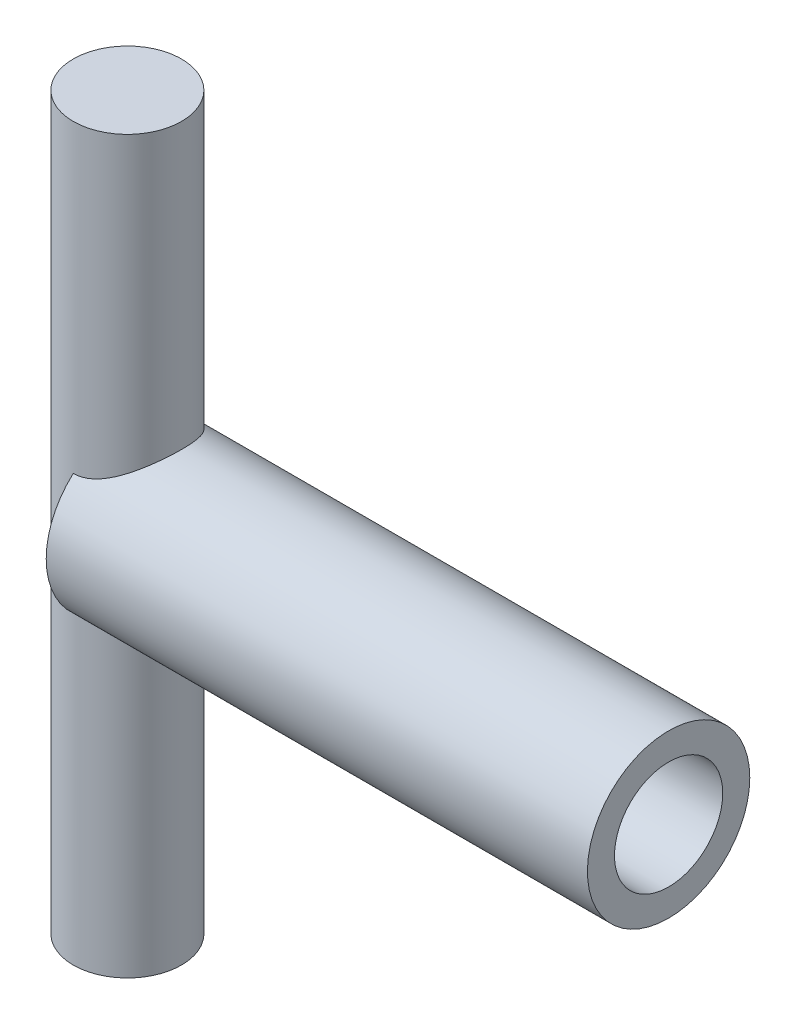
ISO-10303-21;
HEADER;
FILE_DESCRIPTION(('STEP AP214'),'2;1');
FILE_NAME('part.step','',(''),(''),'','','');
FILE_SCHEMA(('AUTOMOTIVE_DESIGN { 1 0 10303 214 1 1 1 1 }'));
ENDSEC;
DATA;
#1=APPLICATION_CONTEXT('core data for automotive mechanical design processes');
#2=APPLICATION_PROTOCOL_DEFINITION('international standard','automotive_design',2000,#1);
#3=PRODUCT_CONTEXT('',#1,'mechanical');
#4=PRODUCT('Part','Part','',(#3));
#5=PRODUCT_RELATED_PRODUCT_CATEGORY('part','',(#4));
#6=PRODUCT_DEFINITION_FORMATION('','',#4);
#7=PRODUCT_DEFINITION_CONTEXT('part definition',#1,'design');
#8=PRODUCT_DEFINITION('design','',#6,#7);
#9=PRODUCT_DEFINITION_SHAPE('','',#8);
#10=(LENGTH_UNIT() NAMED_UNIT(*) SI_UNIT(.MILLI.,.METRE.));
#11=(NAMED_UNIT(*) PLANE_ANGLE_UNIT() SI_UNIT($,.RADIAN.));
#12=(NAMED_UNIT(*) SI_UNIT($,.STERADIAN.) SOLID_ANGLE_UNIT());
#13=UNCERTAINTY_MEASURE_WITH_UNIT(LENGTH_MEASURE(1.E-05),#10,'distance_accuracy_value','');
#14=(GEOMETRIC_REPRESENTATION_CONTEXT(3) GLOBAL_UNCERTAINTY_ASSIGNED_CONTEXT((#13)) GLOBAL_UNIT_ASSIGNED_CONTEXT((#10,
#11,#12)) REPRESENTATION_CONTEXT('',''));
#15=CARTESIAN_POINT('',(0.,0.,0.));
#16=DIRECTION('',(0.,0.,1.));
#17=DIRECTION('',(1.,0.,0.));
#18=AXIS2_PLACEMENT_3D('',#15,#16,#17);
#19=CARTESIAN_POINT('',(0.,13.5,0.));
#20=DIRECTION('',(0.,-1.,0.));
#21=DIRECTION('',(0.,0.,-1.));
#22=AXIS2_PLACEMENT_3D('',#19,#20,#21);
#23=CYLINDRICAL_SURFACE('',#22,1.);
#24=CARTESIAN_POINT('',(0.,0.,0.));
#25=DIRECTION('',(0.,1.,0.));
#26=DIRECTION('',(0.,0.,1.));
#27=AXIS2_PLACEMENT_3D('',#24,#25,#26);
#28=CIRCLE('',#27,1.);
#29=CARTESIAN_POINT('',(0.,0.,1.));
#30=VERTEX_POINT('',#29);
#31=EDGE_CURVE('E82',#30,#30,#28,.T.);
#32=ORIENTED_EDGE('',*,*,#31,.T.);
#33=EDGE_LOOP('',(#32));
#34=FACE_BOUND('',#33,.T.);
#35=CARTESIAN_POINT('',(0.,13.5,0.));
#36=DIRECTION('',(0.,1.,0.));
#37=DIRECTION('',(0.,0.,1.));
#38=AXIS2_PLACEMENT_3D('',#35,#36,#37);
#39=CIRCLE('',#38,1.);
#40=CARTESIAN_POINT('',(0.,13.5,1.));
#41=VERTEX_POINT('',#40);
#42=EDGE_CURVE('E67',#41,#41,#39,.T.);
#43=ORIENTED_EDGE('',*,*,#42,.F.);
#44=EDGE_LOOP('',(#43));
#45=FACE_BOUND('',#44,.T.);
#46=DIRECTION('',(0.,-1.,0.));
#47=VECTOR('',#46,1.);
#48=CARTESIAN_POINT('',(0.,13.5,1.));
#49=LINE('',#48,#47);
#50=CARTESIAN_POINT('',(0.,7.86803398874989,1.));
#51=VERTEX_POINT('',#50);
#52=CARTESIAN_POINT('',(0.,5.6319660112501,1.));
#53=VERTEX_POINT('',#52);
#54=EDGE_CURVE('E11',#51,#53,#49,.T.);
#55=ORIENTED_EDGE('',*,*,#54,.F.);
#56=CARTESIAN_POINT('',(0.,7.86803398874989,-1.));
#57=CARTESIAN_POINT('',(0.0245886500560388,7.8680237697748,-1.00000385931136));
#58=CARTESIAN_POINT('',(0.0491596291828318,7.86884604340699,-0.999092567006582));
#59=CARTESIAN_POINT('',(0.0980344268612528,7.87206137909116,-0.995483557045076));
#60=CARTESIAN_POINT('',(0.122338559120516,7.87445233612189,-0.992788233342938));
#61=CARTESIAN_POINT('',(0.194088141462636,7.88377392407398,-0.982164334210397));
#62=CARTESIAN_POINT('',(0.240903871019032,7.89285735642872,-0.971695698161858));
#63=CARTESIAN_POINT('',(0.331317669804412,7.91526690367521,-0.944697389842912));
#64=CARTESIAN_POINT('',(0.374930348149652,7.9285720637173,-0.928197593458078));
#65=CARTESIAN_POINT('',(0.458823143695584,7.95787820271496,-0.88972845876806));
#66=CARTESIAN_POINT('',(0.49909335048587,7.97388679937279,-0.867743578697688));
#67=CARTESIAN_POINT('',(0.581837025050872,8.00973575834073,-0.81500398529646));
#68=CARTESIAN_POINT('',(0.623690124278091,8.02978605229295,-0.783419211478588));
#69=CARTESIAN_POINT('',(0.702021816595475,8.06973547138357,-0.714074645025094));
#70=CARTESIAN_POINT('',(0.73849819348971,8.08963453099835,-0.676312319560107));
#71=CARTESIAN_POINT('',(0.810320061794087,8.13044303110964,-0.589080702131527));
#72=CARTESIAN_POINT('',(0.844737967892401,8.15108194394723,-0.538708069738798));
#73=CARTESIAN_POINT('',(0.904318608031322,8.18779087889304,-0.431240959277959));
#74=CARTESIAN_POINT('',(0.929490804089492,8.20386556816055,-0.374153432664228));
#75=CARTESIAN_POINT('',(0.966778269944338,8.22799957891011,-0.26162434433819));
#76=CARTESIAN_POINT('',(0.980041768708602,8.23675594067186,-0.206716967933995));
#77=CARTESIAN_POINT('',(0.997092270579771,8.24804874576375,-0.0948473168914586));
#78=CARTESIAN_POINT('',(1.00089127544514,8.2505930663922,-0.0378877377458481));
#79=CARTESIAN_POINT('',(0.998913775189792,8.24927680842361,0.0670735319194516));
#80=CARTESIAN_POINT('',(0.994505473311643,8.24633132352614,0.115120332961133));
#81=CARTESIAN_POINT('',(0.978954470840572,8.23604091199346,0.209619330080893));
#82=CARTESIAN_POINT('',(0.96781128105779,8.22869566578111,0.256071410067066));
#83=CARTESIAN_POINT('',(0.939402159798992,8.21026045892157,0.346038964464756));
#84=CARTESIAN_POINT('',(0.922160563625469,8.19918539018008,0.389565304022146));
#85=CARTESIAN_POINT('',(0.882223180581801,8.17410552730085,0.473104565914574));
#86=CARTESIAN_POINT('',(0.859526396984145,8.16010019783032,0.513116844362639));
#87=CARTESIAN_POINT('',(0.806010233779514,8.12809003928102,0.594142769435114));
#88=CARTESIAN_POINT('',(0.774515376406898,8.10980148396856,0.634596923120098));
#89=CARTESIAN_POINT('',(0.706049548423024,8.07200247927966,0.709995028001506));
#90=CARTESIAN_POINT('',(0.669070285645143,8.05249020593921,0.744930467042532));
#91=CARTESIAN_POINT('',(0.58402524236788,8.0107533475528,0.813855859734848));
#92=CARTESIAN_POINT('',(0.535129520990251,7.98857750950706,0.84685862340875));
#93=CARTESIAN_POINT('',(0.431260423736277,7.94738420693255,0.904166935914104));
#94=CARTESIAN_POINT('',(0.376295628407531,7.92836237610585,0.928484562922565));
#95=CARTESIAN_POINT('',(0.277337195305073,7.90122906987519,0.96176715113386));
#96=CARTESIAN_POINT('',(0.234579698037053,7.89155402187479,0.97312425377185));
#97=CARTESIAN_POINT('',(0.147237257983902,7.87687803938325,0.99009145496556));
#98=CARTESIAN_POINT('',(0.102658906092001,7.87186157894936,0.99572064929833));
#99=CARTESIAN_POINT('',(0.0385703941289943,7.86852632126153,0.999445952936273));
#100=CARTESIAN_POINT('',(0.0192822860756724,7.86801866942659,1.00000817482252));
#101=CARTESIAN_POINT('',(0.,7.86803398875085,1.00000000000001));
#102=B_SPLINE_CURVE_WITH_KNOTS('',3,(#56,#57,#58,#59,#60,#61,#62,#63,#64,#65,#66,#67,#68,#69,
#70,#71,#72,#73,#74,#75,#76,#77,#78,#79,#80,#81,#82,#83,#84,#85,#86,#87,#88,#89,#90,#91,#92,#93,
#94,#95,#96,#97,#98,#99,#100,#101),.UNSPECIFIED.,.F.,.F.,(4,2,2,2,2,2,2,2,2,2,2,2,2,2,2,2,2,2,2,
2,2,2,4),(0.,0.0737031503435038,0.147307599925077,0.292943679284428,0.437867903236061,
0.583207522794039,0.750995192707301,0.91885182968239,1.11100020184132,1.30295137868299,
1.4733622496578,1.64355691535552,1.78787192753802,1.93219742332876,2.07595337692235,
2.21973561642925,2.3824142017618,2.54534130552198,2.73354031019313,2.92147656321561,
3.05680181802797,3.19167443078332,3.2495263316285),.UNSPECIFIED.);
#103=CARTESIAN_POINT('',(0.,7.86803398874989,-1.));
#104=VERTEX_POINT('',#103);
#105=EDGE_CURVE('E43',#104,#51,#102,.T.);
#106=ORIENTED_EDGE('',*,*,#105,.F.);
#107=DIRECTION('',(0.,-1.,0.));
#108=VECTOR('',#107,1.);
#109=CARTESIAN_POINT('',(0.,13.5,-1.));
#110=LINE('',#109,#108);
#111=CARTESIAN_POINT('',(0.,5.6319660112501,-1.));
#112=VERTEX_POINT('',#111);
#113=EDGE_CURVE('E58',#112,#104,#110,.F.);
#114=ORIENTED_EDGE('',*,*,#113,.F.);
#115=CARTESIAN_POINT('',(0.,5.6319660112501,1.));
#116=CARTESIAN_POINT('',(0.0245886500560387,5.63197623022519,1.00000385931136));
#117=CARTESIAN_POINT('',(0.0491596291828318,5.63115395659301,0.999092567006582));
#118=CARTESIAN_POINT('',(0.0980344268612527,5.62793862090883,0.995483557045076));
#119=CARTESIAN_POINT('',(0.122338559120516,5.62554766387811,0.992788233342938));
#120=CARTESIAN_POINT('',(0.194088141462636,5.61622607592602,0.982164334210397));
#121=CARTESIAN_POINT('',(0.240903871019032,5.60714264357128,0.971695698161858));
#122=CARTESIAN_POINT('',(0.331317669804412,5.58473309632479,0.944697389842912));
#123=CARTESIAN_POINT('',(0.374930348149652,5.57142793628269,0.928197593458078));
#124=CARTESIAN_POINT('',(0.458823143695584,5.54212179728504,0.88972845876806));
#125=CARTESIAN_POINT('',(0.499093350485871,5.52611320062721,0.867743578697688));
#126=CARTESIAN_POINT('',(0.581837025050872,5.49026424165927,0.81500398529646));
#127=CARTESIAN_POINT('',(0.623690124278091,5.47021394770705,0.783419211478588));
#128=CARTESIAN_POINT('',(0.702021816595475,5.43026452861643,0.714074645025094));
#129=CARTESIAN_POINT('',(0.73849819348971,5.41036546900165,0.676312319560107));
#130=CARTESIAN_POINT('',(0.810320061794087,5.36955696889036,0.589080702131526));
#131=CARTESIAN_POINT('',(0.844737967892402,5.34891805605277,0.538708069738798));
#132=CARTESIAN_POINT('',(0.904318608031322,5.31220912110695,0.431240959277959));
#133=CARTESIAN_POINT('',(0.929490804089492,5.29613443183945,0.374153432664228));
#134=CARTESIAN_POINT('',(0.966778269944338,5.27200042108989,0.26162434433819));
#135=CARTESIAN_POINT('',(0.980041768708602,5.26324405932814,0.206716967933995));
#136=CARTESIAN_POINT('',(0.997092270579771,5.25195125423625,0.0948473168914586));
#137=CARTESIAN_POINT('',(1.00089127544514,5.2494069336078,0.0378877377458479));
#138=CARTESIAN_POINT('',(0.998913775189792,5.25072319157639,-0.0670735319194517));
#139=CARTESIAN_POINT('',(0.994505473311643,5.25366867647386,-0.115120332961133));
#140=CARTESIAN_POINT('',(0.978954470840572,5.26395908800653,-0.209619330080893));
#141=CARTESIAN_POINT('',(0.96781128105779,5.27130433421889,-0.256071410067066));
#142=CARTESIAN_POINT('',(0.939402159798991,5.28973954107843,-0.346038964464756));
#143=CARTESIAN_POINT('',(0.922160563625469,5.30081460981992,-0.389565304022146));
#144=CARTESIAN_POINT('',(0.882223180581801,5.32589447269915,-0.473104565914574));
#145=CARTESIAN_POINT('',(0.859526396984145,5.33989980216968,-0.513116844362639));
#146=CARTESIAN_POINT('',(0.806010233779514,5.37190996071898,-0.594142769435114));
#147=CARTESIAN_POINT('',(0.774515376406899,5.39019851603144,-0.634596923120098));
#148=CARTESIAN_POINT('',(0.706049548423024,5.42799752072034,-0.709995028001506));
#149=CARTESIAN_POINT('',(0.669070285645143,5.44750979406079,-0.744930467042532));
#150=CARTESIAN_POINT('',(0.584025242367879,5.4892466524472,-0.813855859734848));
#151=CARTESIAN_POINT('',(0.535129520990251,5.51142249049294,-0.846858623408751));
#152=CARTESIAN_POINT('',(0.431260423736277,5.55261579306745,-0.904166935914104));
#153=CARTESIAN_POINT('',(0.376295628407531,5.57163762389415,-0.928484562922565));
#154=CARTESIAN_POINT('',(0.277337195305073,5.59877093012481,-0.96176715113386));
#155=CARTESIAN_POINT('',(0.234579698037053,5.60844597812521,-0.97312425377185));
#156=CARTESIAN_POINT('',(0.147237257983902,5.62312196061675,-0.99009145496556));
#157=CARTESIAN_POINT('',(0.102658906092001,5.62813842105064,-0.99572064929833));
#158=CARTESIAN_POINT('',(0.0385703941289942,5.63147367873847,-0.999445952936273));
#159=CARTESIAN_POINT('',(0.0192822860756724,5.63198133057341,-1.00000817482252));
#160=CARTESIAN_POINT('',(0.,5.63196601124915,-1.00000000000001));
#161=B_SPLINE_CURVE_WITH_KNOTS('',3,(#115,#116,#117,#118,#119,#120,#121,#122,#123,#124,#125,
#126,#127,#128,#129,#130,#131,#132,#133,#134,#135,#136,#137,#138,#139,#140,#141,#142,#143,#144,
#145,#146,#147,#148,#149,#150,#151,#152,#153,#154,#155,#156,#157,#158,#159,#160),.UNSPECIFIED.,
.F.,.F.,(4,2,2,2,2,2,2,2,2,2,2,2,2,2,2,2,2,2,2,2,2,2,4),(0.,0.0737031503435037,
0.147307599925077,0.292943679284428,0.437867903236061,0.583207522794039,0.7509951927073,
0.918851829682391,1.11100020184132,1.30295137868299,1.4733622496578,1.64355691535552,
1.78787192753802,1.93219742332876,2.07595337692235,2.21973561642925,2.3824142017618,
2.54534130552198,2.73354031019313,2.92147656321561,3.05680181802797,3.19167443078332,
3.2495263316285),.UNSPECIFIED.);
#162=EDGE_CURVE('E53',#53,#112,#161,.T.);
#163=ORIENTED_EDGE('',*,*,#162,.F.);
#164=EDGE_LOOP('',(#55,#106,#114,#163));
#165=FACE_BOUND('',#164,.T.);
#166=ADVANCED_FACE('F35',(#34,#45,#165),#23,.T.);
#167=CARTESIAN_POINT('',(0.,13.5,0.));
#168=DIRECTION('',(0.,1.,0.));
#169=DIRECTION('',(0.,0.,1.));
#170=AXIS2_PLACEMENT_3D('',#167,#168,#169);
#171=PLANE('',#170);
#172=ORIENTED_EDGE('',*,*,#42,.T.);
#173=EDGE_LOOP('',(#172));
#174=FACE_BOUND('',#173,.T.);
#175=ADVANCED_FACE('F100',(#174),#171,.T.);
#176=CARTESIAN_POINT('',(0.,0.,0.));
#177=DIRECTION('',(0.,1.,0.));
#178=DIRECTION('',(0.,0.,1.));
#179=AXIS2_PLACEMENT_3D('',#176,#177,#178);
#180=PLANE('',#179);
#181=ORIENTED_EDGE('',*,*,#31,.F.);
#182=EDGE_LOOP('',(#181));
#183=FACE_BOUND('',#182,.T.);
#184=ADVANCED_FACE('F97',(#183),#180,.F.);
#185=CARTESIAN_POINT('',(10.,6.75,0.));
#186=DIRECTION('',(-1.,0.,0.));
#187=DIRECTION('',(0.,0.,1.));
#188=AXIS2_PLACEMENT_3D('',#185,#186,#187);
#189=CYLINDRICAL_SURFACE('',#188,1.5);
#190=CARTESIAN_POINT('',(10.,6.75,0.));
#191=DIRECTION('',(1.,0.,0.));
#192=DIRECTION('',(0.,0.,-1.));
#193=AXIS2_PLACEMENT_3D('',#190,#191,#192);
#194=CIRCLE('',#193,1.5);
#195=CARTESIAN_POINT('',(10.,6.75,-1.5));
#196=VERTEX_POINT('',#195);
#197=EDGE_CURVE('E73',#196,#196,#194,.T.);
#198=ORIENTED_EDGE('',*,*,#197,.F.);
#199=EDGE_LOOP('',(#198));
#200=FACE_BOUND('',#199,.T.);
#201=CARTESIAN_POINT('',(0.,6.75,0.));
#202=DIRECTION('',(1.,0.,0.));
#203=DIRECTION('',(0.,0.,-1.));
#204=AXIS2_PLACEMENT_3D('',#201,#202,#203);
#205=CIRCLE('',#204,1.5);
#206=EDGE_CURVE('E66',#112,#104,#205,.T.);
#207=ORIENTED_EDGE('',*,*,#206,.T.);
#208=ORIENTED_EDGE('',*,*,#105,.T.);
#209=EDGE_CURVE('E70',#51,#53,#205,.T.);
#210=ORIENTED_EDGE('',*,*,#209,.T.);
#211=ORIENTED_EDGE('',*,*,#162,.T.);
#212=EDGE_LOOP('',(#207,#208,#210,#211));
#213=FACE_BOUND('',#212,.T.);
#214=ADVANCED_FACE('F69',(#200,#213),#189,.T.);
#215=CARTESIAN_POINT('',(0.,6.75,0.));
#216=DIRECTION('',(1.,0.,0.));
#217=DIRECTION('',(0.,0.,-1.));
#218=AXIS2_PLACEMENT_3D('',#215,#216,#217);
#219=PLANE('',#218);
#220=ORIENTED_EDGE('',*,*,#209,.F.);
#221=ORIENTED_EDGE('',*,*,#54,.T.);
#222=EDGE_LOOP('',(#220,#221));
#223=FACE_BOUND('',#222,.T.);
#224=ADVANCED_FACE('F96',(#223),#219,.F.);
#225=ORIENTED_EDGE('',*,*,#206,.F.);
#226=ORIENTED_EDGE('',*,*,#113,.T.);
#227=EDGE_LOOP('',(#225,#226));
#228=FACE_BOUND('',#227,.T.);
#229=ADVANCED_FACE('F65',(#228),#219,.F.);
#230=CARTESIAN_POINT('',(10.,6.75,0.));
#231=DIRECTION('',(1.,0.,0.));
#232=DIRECTION('',(0.,0.,-1.));
#233=AXIS2_PLACEMENT_3D('',#230,#231,#232);
#234=PLANE('',#233);
#235=CARTESIAN_POINT('',(10.,6.75,0.));
#236=DIRECTION('',(1.,0.,0.));
#237=DIRECTION('',(0.,0.,-1.));
#238=AXIS2_PLACEMENT_3D('',#235,#236,#237);
#239=CIRCLE('',#238,1.);
#240=CARTESIAN_POINT('',(10.,6.75,-1.));
#241=VERTEX_POINT('',#240);
#242=EDGE_CURVE('E75',#241,#241,#239,.T.);
#243=ORIENTED_EDGE('',*,*,#242,.F.);
#244=EDGE_LOOP('',(#243));
#245=FACE_BOUND('',#244,.T.);
#246=ORIENTED_EDGE('',*,*,#197,.T.);
#247=EDGE_LOOP('',(#246));
#248=FACE_BOUND('',#247,.T.);
#249=ADVANCED_FACE('F140',(#245,#248),#234,.T.);
#250=CARTESIAN_POINT('',(1.,6.75,0.));
#251=DIRECTION('',(1.,0.,0.));
#252=DIRECTION('',(0.,0.,-1.));
#253=AXIS2_PLACEMENT_3D('',#250,#251,#252);
#254=CYLINDRICAL_SURFACE('',#253,1.);
#255=CARTESIAN_POINT('',(1.,6.75,0.));
#256=DIRECTION('',(1.,0.,0.));
#257=DIRECTION('',(0.,0.,-1.));
#258=AXIS2_PLACEMENT_3D('',#255,#256,#257);
#259=CIRCLE('',#258,1.);
#260=CARTESIAN_POINT('',(1.,6.75,-1.));
#261=VERTEX_POINT('',#260);
#262=EDGE_CURVE('E71',#261,#261,#259,.T.);
#263=ORIENTED_EDGE('',*,*,#262,.F.);
#264=EDGE_LOOP('',(#263));
#265=FACE_BOUND('',#264,.T.);
#266=ORIENTED_EDGE('',*,*,#242,.T.);
#267=EDGE_LOOP('',(#266));
#268=FACE_BOUND('',#267,.T.);
#269=ADVANCED_FACE('F148',(#265,#268),#254,.F.);
#270=CARTESIAN_POINT('',(1.,6.75,0.));
#271=DIRECTION('',(1.,0.,0.));
#272=DIRECTION('',(0.,0.,-1.));
#273=AXIS2_PLACEMENT_3D('',#270,#271,#272);
#274=PLANE('',#273);
#275=ORIENTED_EDGE('',*,*,#262,.T.);
#276=EDGE_LOOP('',(#275));
#277=FACE_BOUND('',#276,.T.);
#278=ADVANCED_FACE('F157',(#277),#274,.T.);
#279=CLOSED_SHELL('',(#166,#175,#184,#214,#224,#229,#249,#269,#278));
#280=MANIFOLD_SOLID_BREP('B2',#279);
#281=ADVANCED_BREP_SHAPE_REPRESENTATION('',(#18,#280),#14);
#282=SHAPE_DEFINITION_REPRESENTATION(#9,#281);
ENDSEC;
END-ISO-10303-21;
